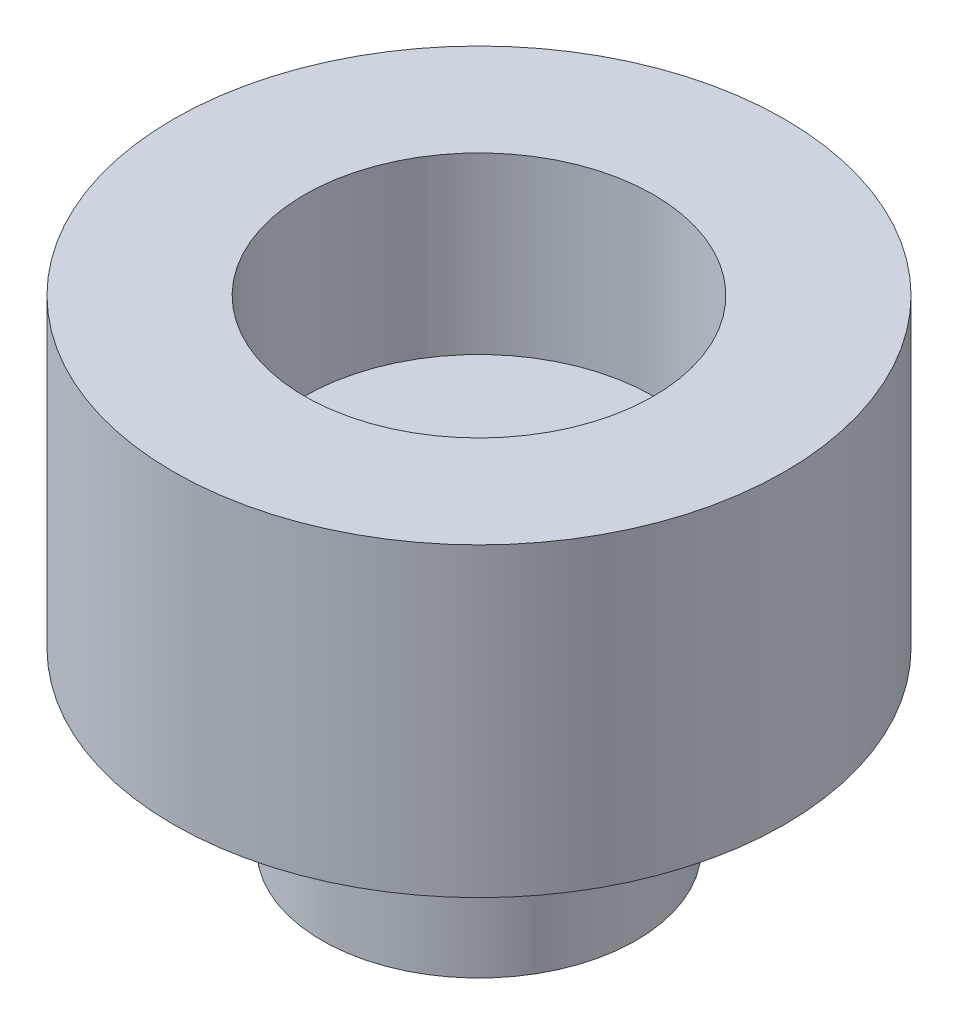
ISO-10303-21;
HEADER;
FILE_DESCRIPTION(('STEP AP214'),'2;1');
FILE_NAME('part.step','',(''),(''),'','','');
FILE_SCHEMA(('AUTOMOTIVE_DESIGN { 1 0 10303 214 1 1 1 1 }'));
ENDSEC;
DATA;
#1=APPLICATION_CONTEXT('core data for automotive mechanical design processes');
#2=APPLICATION_PROTOCOL_DEFINITION('international standard','automotive_design',2000,#1);
#3=PRODUCT_CONTEXT('',#1,'mechanical');
#4=PRODUCT('Part','Part','',(#3));
#5=PRODUCT_RELATED_PRODUCT_CATEGORY('part','',(#4));
#6=PRODUCT_DEFINITION_FORMATION('','',#4);
#7=PRODUCT_DEFINITION_CONTEXT('part definition',#1,'design');
#8=PRODUCT_DEFINITION('design','',#6,#7);
#9=PRODUCT_DEFINITION_SHAPE('','',#8);
#10=(LENGTH_UNIT() NAMED_UNIT(*) SI_UNIT(.MILLI.,.METRE.));
#11=(NAMED_UNIT(*) PLANE_ANGLE_UNIT() SI_UNIT($,.RADIAN.));
#12=(NAMED_UNIT(*) SI_UNIT($,.STERADIAN.) SOLID_ANGLE_UNIT());
#13=UNCERTAINTY_MEASURE_WITH_UNIT(LENGTH_MEASURE(1.E-05),#10,'distance_accuracy_value','');
#14=(GEOMETRIC_REPRESENTATION_CONTEXT(3) GLOBAL_UNCERTAINTY_ASSIGNED_CONTEXT((#13)) GLOBAL_UNIT_ASSIGNED_CONTEXT((#10,
#11,#12)) REPRESENTATION_CONTEXT('',''));
#15=CARTESIAN_POINT('',(0.,0.,0.));
#16=DIRECTION('',(0.,0.,1.));
#17=DIRECTION('',(1.,0.,0.));
#18=AXIS2_PLACEMENT_3D('',#15,#16,#17);
#19=CARTESIAN_POINT('',(1.8,0.,0.));
#20=DIRECTION('',(0.,-1.,0.));
#21=DIRECTION('',(0.,0.,-1.));
#22=AXIS2_PLACEMENT_3D('',#19,#20,#21);
#23=PLANE('',#22);
#24=CARTESIAN_POINT('',(0.,0.,0.));
#25=DIRECTION('',(0.,-1.,0.));
#26=DIRECTION('',(0.,0.,-1.));
#27=AXIS2_PLACEMENT_3D('',#24,#25,#26);
#28=CIRCLE('',#27,1.8);
#29=CARTESIAN_POINT('',(0.,0.,-1.8));
#30=VERTEX_POINT('',#29);
#31=EDGE_CURVE('E61',#30,#30,#28,.T.);
#32=ORIENTED_EDGE('',*,*,#31,.T.);
#33=EDGE_LOOP('',(#32));
#34=FACE_BOUND('',#33,.T.);
#35=ADVANCED_FACE('F39',(#34),#23,.T.);
#36=CARTESIAN_POINT('',(0.,3.5,0.));
#37=DIRECTION('',(0.,1.,0.));
#38=DIRECTION('',(0.,0.,1.));
#39=AXIS2_PLACEMENT_3D('',#36,#37,#38);
#40=PLANE('',#39);
#41=CARTESIAN_POINT('',(0.,3.5,0.));
#42=DIRECTION('',(0.,-1.,0.));
#43=DIRECTION('',(0.,0.,-1.));
#44=AXIS2_PLACEMENT_3D('',#41,#42,#43);
#45=CIRCLE('',#44,2.);
#46=CARTESIAN_POINT('',(0.,3.5,-2.));
#47=VERTEX_POINT('',#46);
#48=EDGE_CURVE('E10',#47,#47,#45,.T.);
#49=ORIENTED_EDGE('',*,*,#48,.F.);
#50=EDGE_LOOP('',(#49));
#51=FACE_BOUND('',#50,.T.);
#52=ADVANCED_FACE('F78',(#51),#40,.T.);
#53=CARTESIAN_POINT('',(0.,0.,0.));
#54=DIRECTION('',(0.,-1.,0.));
#55=DIRECTION('',(0.,0.,-1.));
#56=AXIS2_PLACEMENT_3D('',#53,#54,#55);
#57=CYLINDRICAL_SURFACE('',#56,2.);
#58=ORIENTED_EDGE('',*,*,#48,.T.);
#59=EDGE_LOOP('',(#58));
#60=FACE_BOUND('',#59,.T.);
#61=CARTESIAN_POINT('',(0.,5.5,0.));
#62=DIRECTION('',(0.,-1.,0.));
#63=DIRECTION('',(0.,0.,-1.));
#64=AXIS2_PLACEMENT_3D('',#61,#62,#63);
#65=CIRCLE('',#64,2.);
#66=CARTESIAN_POINT('',(0.,5.5,-2.));
#67=VERTEX_POINT('',#66);
#68=EDGE_CURVE('E45',#67,#67,#65,.T.);
#69=ORIENTED_EDGE('',*,*,#68,.F.);
#70=EDGE_LOOP('',(#69));
#71=FACE_BOUND('',#70,.T.);
#72=ADVANCED_FACE('F82',(#60,#71),#57,.F.);
#73=CARTESIAN_POINT('',(2.,5.5,0.));
#74=DIRECTION('',(0.,1.,0.));
#75=DIRECTION('',(0.,0.,1.));
#76=AXIS2_PLACEMENT_3D('',#73,#74,#75);
#77=PLANE('',#76);
#78=ORIENTED_EDGE('',*,*,#68,.T.);
#79=EDGE_LOOP('',(#78));
#80=FACE_BOUND('',#79,.T.);
#81=CARTESIAN_POINT('',(0.,5.5,0.));
#82=DIRECTION('',(0.,-1.,0.));
#83=DIRECTION('',(0.,0.,-1.));
#84=AXIS2_PLACEMENT_3D('',#81,#82,#83);
#85=CIRCLE('',#84,3.5);
#86=CARTESIAN_POINT('',(0.,5.5,-3.5));
#87=VERTEX_POINT('',#86);
#88=EDGE_CURVE('E49',#87,#87,#85,.T.);
#89=ORIENTED_EDGE('',*,*,#88,.F.);
#90=EDGE_LOOP('',(#89));
#91=FACE_BOUND('',#90,.T.);
#92=ADVANCED_FACE('F87',(#80,#91),#77,.T.);
#93=CARTESIAN_POINT('',(0.,0.,0.));
#94=DIRECTION('',(0.,-1.,0.));
#95=DIRECTION('',(0.,0.,-1.));
#96=AXIS2_PLACEMENT_3D('',#93,#94,#95);
#97=CYLINDRICAL_SURFACE('',#96,3.5);
#98=ORIENTED_EDGE('',*,*,#88,.T.);
#99=EDGE_LOOP('',(#98));
#100=FACE_BOUND('',#99,.T.);
#101=CARTESIAN_POINT('',(0.,2.,0.));
#102=DIRECTION('',(0.,-1.,0.));
#103=DIRECTION('',(0.,0.,-1.));
#104=AXIS2_PLACEMENT_3D('',#101,#102,#103);
#105=CIRCLE('',#104,3.5);
#106=CARTESIAN_POINT('',(0.,2.,-3.5));
#107=VERTEX_POINT('',#106);
#108=EDGE_CURVE('E53',#107,#107,#105,.T.);
#109=ORIENTED_EDGE('',*,*,#108,.F.);
#110=EDGE_LOOP('',(#109));
#111=FACE_BOUND('',#110,.T.);
#112=ADVANCED_FACE('F74',(#100,#111),#97,.T.);
#113=CARTESIAN_POINT('',(3.5,2.,0.));
#114=DIRECTION('',(0.,-1.,0.));
#115=DIRECTION('',(0.,0.,-1.));
#116=AXIS2_PLACEMENT_3D('',#113,#114,#115);
#117=PLANE('',#116);
#118=ORIENTED_EDGE('',*,*,#108,.T.);
#119=EDGE_LOOP('',(#118));
#120=FACE_BOUND('',#119,.T.);
#121=CARTESIAN_POINT('',(0.,2.,0.));
#122=DIRECTION('',(0.,-1.,0.));
#123=DIRECTION('',(0.,0.,-1.));
#124=AXIS2_PLACEMENT_3D('',#121,#122,#123);
#125=CIRCLE('',#124,1.8);
#126=CARTESIAN_POINT('',(0.,2.,-1.8));
#127=VERTEX_POINT('',#126);
#128=EDGE_CURVE('E58',#127,#127,#125,.T.);
#129=ORIENTED_EDGE('',*,*,#128,.F.);
#130=EDGE_LOOP('',(#129));
#131=FACE_BOUND('',#130,.T.);
#132=ADVANCED_FACE('F68',(#120,#131),#117,.T.);
#133=CARTESIAN_POINT('',(0.,0.,0.));
#134=DIRECTION('',(0.,-1.,0.));
#135=DIRECTION('',(0.,0.,-1.));
#136=AXIS2_PLACEMENT_3D('',#133,#134,#135);
#137=CYLINDRICAL_SURFACE('',#136,1.8);
#138=ORIENTED_EDGE('',*,*,#128,.T.);
#139=EDGE_LOOP('',(#138));
#140=FACE_BOUND('',#139,.T.);
#141=ORIENTED_EDGE('',*,*,#31,.F.);
#142=EDGE_LOOP('',(#141));
#143=FACE_BOUND('',#142,.T.);
#144=ADVANCED_FACE('F66',(#140,#143),#137,.T.);
#145=CLOSED_SHELL('',(#35,#52,#72,#92,#112,#132,#144));
#146=MANIFOLD_SOLID_BREP('B2',#145);
#147=ADVANCED_BREP_SHAPE_REPRESENTATION('',(#18,#146),#14);
#148=SHAPE_DEFINITION_REPRESENTATION(#9,#147);
ENDSEC;
END-ISO-10303-21;
